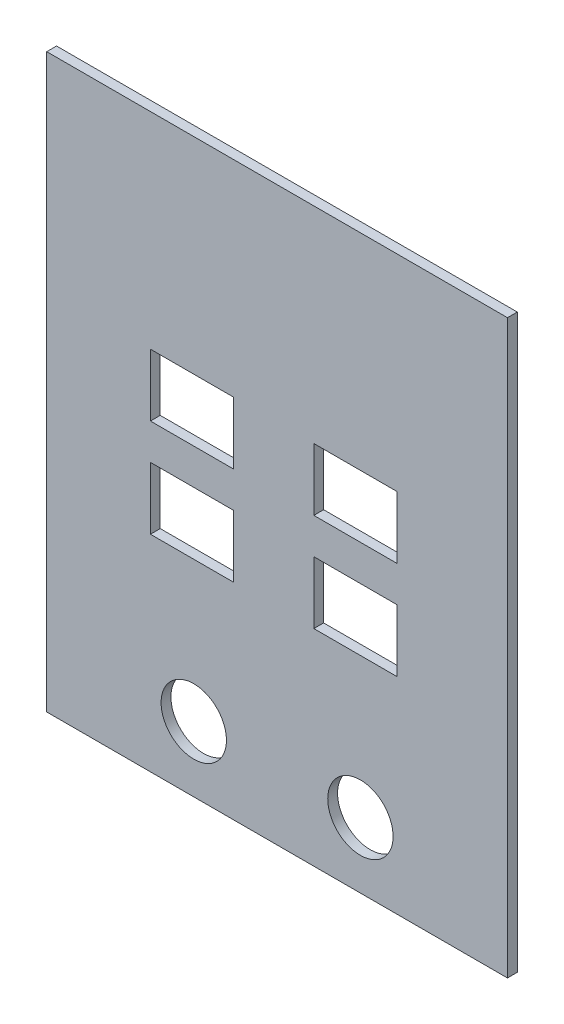
ISO-10303-21;
HEADER;
FILE_DESCRIPTION(('STEP AP214'),'2;1');
FILE_NAME('part.step','',(''),(''),'','','');
FILE_SCHEMA(('AUTOMOTIVE_DESIGN { 1 0 10303 214 1 1 1 1 }'));
ENDSEC;
DATA;
#1=APPLICATION_CONTEXT('core data for automotive mechanical design processes');
#2=APPLICATION_PROTOCOL_DEFINITION('international standard','automotive_design',2000,#1);
#3=PRODUCT_CONTEXT('',#1,'mechanical');
#4=PRODUCT('Part','Part','',(#3));
#5=PRODUCT_RELATED_PRODUCT_CATEGORY('part','',(#4));
#6=PRODUCT_DEFINITION_FORMATION('','',#4);
#7=PRODUCT_DEFINITION_CONTEXT('part definition',#1,'design');
#8=PRODUCT_DEFINITION('design','',#6,#7);
#9=PRODUCT_DEFINITION_SHAPE('','',#8);
#10=(LENGTH_UNIT() NAMED_UNIT(*) SI_UNIT(.MILLI.,.METRE.));
#11=(NAMED_UNIT(*) PLANE_ANGLE_UNIT() SI_UNIT($,.RADIAN.));
#12=(NAMED_UNIT(*) SI_UNIT($,.STERADIAN.) SOLID_ANGLE_UNIT());
#13=UNCERTAINTY_MEASURE_WITH_UNIT(LENGTH_MEASURE(1.E-05),#10,'distance_accuracy_value','');
#14=(GEOMETRIC_REPRESENTATION_CONTEXT(3) GLOBAL_UNCERTAINTY_ASSIGNED_CONTEXT((#13)) GLOBAL_UNIT_ASSIGNED_CONTEXT((#10,
#11,#12)) REPRESENTATION_CONTEXT('',''));
#15=CARTESIAN_POINT('',(0.,0.,0.));
#16=DIRECTION('',(0.,0.,1.));
#17=DIRECTION('',(1.,0.,0.));
#18=AXIS2_PLACEMENT_3D('',#15,#16,#17);
#19=CARTESIAN_POINT('',(-69.1698113207547,64.5141509433962,3.));
#20=DIRECTION('',(0.,1.,0.));
#21=DIRECTION('',(0.,0.,1.));
#22=AXIS2_PLACEMENT_3D('',#19,#20,#21);
#23=PLANE('',#22);
#24=DIRECTION('',(1.,0.,0.));
#25=VECTOR('',#24,1.);
#26=CARTESIAN_POINT('',(-69.1698113207547,64.5141509433962,0.));
#27=LINE('',#26,#25);
#28=CARTESIAN_POINT('',(-69.1698113207547,64.5141509433962,0.));
#29=VERTEX_POINT('',#28);
#30=CARTESIAN_POINT('',(71.8301886792453,64.5141509433962,0.));
#31=VERTEX_POINT('',#30);
#32=EDGE_CURVE('E325',#29,#31,#27,.T.);
#33=ORIENTED_EDGE('',*,*,#32,.F.);
#34=DIRECTION('',(0.,0.,-1.));
#35=VECTOR('',#34,1.);
#36=CARTESIAN_POINT('',(-69.1698113207547,64.5141509433962,3.));
#37=LINE('',#36,#35);
#38=CARTESIAN_POINT('',(-69.1698113207547,64.5141509433962,3.));
#39=VERTEX_POINT('',#38);
#40=EDGE_CURVE('E11',#39,#29,#37,.T.);
#41=ORIENTED_EDGE('',*,*,#40,.F.);
#42=DIRECTION('',(1.,0.,0.));
#43=VECTOR('',#42,1.);
#44=CARTESIAN_POINT('',(-69.1698113207547,64.5141509433962,3.));
#45=LINE('',#44,#43);
#46=CARTESIAN_POINT('',(71.8301886792453,64.5141509433962,3.));
#47=VERTEX_POINT('',#46);
#48=EDGE_CURVE('E326',#39,#47,#45,.T.);
#49=ORIENTED_EDGE('',*,*,#48,.T.);
#50=DIRECTION('',(0.,0.,-1.));
#51=VECTOR('',#50,1.);
#52=CARTESIAN_POINT('',(71.8301886792453,64.5141509433962,3.));
#53=LINE('',#52,#51);
#54=EDGE_CURVE('E42',#47,#31,#53,.T.);
#55=ORIENTED_EDGE('',*,*,#54,.T.);
#56=EDGE_LOOP('',(#33,#41,#49,#55));
#57=FACE_BOUND('',#56,.T.);
#58=ADVANCED_FACE('F39',(#57),#23,.T.);
#59=CARTESIAN_POINT('',(-69.1698113207547,64.5141509433962,3.));
#60=DIRECTION('',(1.,0.,0.));
#61=DIRECTION('',(0.,1.,0.));
#62=AXIS2_PLACEMENT_3D('',#59,#60,#61);
#63=PLANE('',#62);
#64=DIRECTION('',(0.,-1.,0.));
#65=VECTOR('',#64,1.);
#66=CARTESIAN_POINT('',(-69.1698113207547,64.5141509433962,0.));
#67=LINE('',#66,#65);
#68=CARTESIAN_POINT('',(-69.1698113207547,-110.485849056604,0.));
#69=VERTEX_POINT('',#68);
#70=EDGE_CURVE('E330',#29,#69,#67,.T.);
#71=ORIENTED_EDGE('',*,*,#70,.T.);
#72=DIRECTION('',(0.,0.,-1.));
#73=VECTOR('',#72,1.);
#74=CARTESIAN_POINT('',(-69.1698113207547,-110.485849056604,3.));
#75=LINE('',#74,#73);
#76=CARTESIAN_POINT('',(-69.1698113207547,-110.485849056604,3.));
#77=VERTEX_POINT('',#76);
#78=EDGE_CURVE('E47',#77,#69,#75,.T.);
#79=ORIENTED_EDGE('',*,*,#78,.F.);
#80=DIRECTION('',(0.,-1.,0.));
#81=VECTOR('',#80,1.);
#82=CARTESIAN_POINT('',(-69.1698113207547,64.5141509433962,3.));
#83=LINE('',#82,#81);
#84=EDGE_CURVE('E335',#39,#77,#83,.T.);
#85=ORIENTED_EDGE('',*,*,#84,.F.);
#86=ORIENTED_EDGE('',*,*,#40,.T.);
#87=EDGE_LOOP('',(#71,#79,#85,#86));
#88=FACE_BOUND('',#87,.T.);
#89=ADVANCED_FACE('F361',(#88),#63,.F.);
#90=CARTESIAN_POINT('',(-69.1698113207547,-110.485849056604,3.));
#91=DIRECTION('',(0.,1.,0.));
#92=DIRECTION('',(0.,0.,1.));
#93=AXIS2_PLACEMENT_3D('',#90,#91,#92);
#94=PLANE('',#93);
#95=DIRECTION('',(1.,0.,0.));
#96=VECTOR('',#95,1.);
#97=CARTESIAN_POINT('',(-69.1698113207547,-110.485849056604,0.));
#98=LINE('',#97,#96);
#99=CARTESIAN_POINT('',(71.8301886792453,-110.485849056604,0.));
#100=VERTEX_POINT('',#99);
#101=EDGE_CURVE('E342',#69,#100,#98,.T.);
#102=ORIENTED_EDGE('',*,*,#101,.T.);
#103=DIRECTION('',(0.,0.,-1.));
#104=VECTOR('',#103,1.);
#105=CARTESIAN_POINT('',(71.8301886792453,-110.485849056604,3.));
#106=LINE('',#105,#104);
#107=CARTESIAN_POINT('',(71.8301886792453,-110.485849056604,3.));
#108=VERTEX_POINT('',#107);
#109=EDGE_CURVE('E347',#108,#100,#106,.T.);
#110=ORIENTED_EDGE('',*,*,#109,.F.);
#111=DIRECTION('',(1.,0.,0.));
#112=VECTOR('',#111,1.);
#113=CARTESIAN_POINT('',(-69.1698113207547,-110.485849056604,3.));
#114=LINE('',#113,#112);
#115=EDGE_CURVE('E333',#77,#108,#114,.T.);
#116=ORIENTED_EDGE('',*,*,#115,.F.);
#117=ORIENTED_EDGE('',*,*,#78,.T.);
#118=EDGE_LOOP('',(#102,#110,#116,#117));
#119=FACE_BOUND('',#118,.T.);
#120=ADVANCED_FACE('F365',(#119),#94,.F.);
#121=CARTESIAN_POINT('',(71.8301886792453,64.5141509433962,3.));
#122=DIRECTION('',(1.,0.,0.));
#123=DIRECTION('',(0.,1.,0.));
#124=AXIS2_PLACEMENT_3D('',#121,#122,#123);
#125=PLANE('',#124);
#126=DIRECTION('',(0.,-1.,0.));
#127=VECTOR('',#126,1.);
#128=CARTESIAN_POINT('',(71.8301886792453,64.5141509433962,0.));
#129=LINE('',#128,#127);
#130=EDGE_CURVE('E339',#31,#100,#129,.T.);
#131=ORIENTED_EDGE('',*,*,#130,.F.);
#132=ORIENTED_EDGE('',*,*,#54,.F.);
#133=DIRECTION('',(0.,-1.,0.));
#134=VECTOR('',#133,1.);
#135=CARTESIAN_POINT('',(71.8301886792453,64.5141509433962,3.));
#136=LINE('',#135,#134);
#137=EDGE_CURVE('E329',#47,#108,#136,.T.);
#138=ORIENTED_EDGE('',*,*,#137,.T.);
#139=ORIENTED_EDGE('',*,*,#109,.T.);
#140=EDGE_LOOP('',(#131,#132,#138,#139));
#141=FACE_BOUND('',#140,.T.);
#142=ADVANCED_FACE('F355',(#141),#125,.T.);
#143=CARTESIAN_POINT('',(0.,0.,3.));
#144=DIRECTION('',(0.,0.,-1.));
#145=DIRECTION('',(-1.,0.,0.));
#146=AXIS2_PLACEMENT_3D('',#143,#144,#145);
#147=PLANE('',#146);
#148=CARTESIAN_POINT('',(26.8301886792453,-90.4858490566037,3.));
#149=DIRECTION('',(0.,0.,1.));
#150=DIRECTION('',(-1.,0.,0.));
#151=AXIS2_PLACEMENT_3D('',#148,#149,#150);
#152=CIRCLE('',#151,10.);
#153=CARTESIAN_POINT('',(16.8301886792453,-90.4858490566037,3.));
#154=VERTEX_POINT('',#153);
#155=EDGE_CURVE('E589',#154,#154,#152,.T.);
#156=ORIENTED_EDGE('',*,*,#155,.F.);
#157=EDGE_LOOP('',(#156));
#158=FACE_BOUND('',#157,.T.);
#159=CARTESIAN_POINT('',(-24.1698113207547,-90.4858490566037,3.));
#160=DIRECTION('',(0.,0.,1.));
#161=DIRECTION('',(1.,0.,0.));
#162=AXIS2_PLACEMENT_3D('',#159,#160,#161);
#163=CIRCLE('',#162,10.);
#164=CARTESIAN_POINT('',(-14.1698113207547,-90.4858490566037,3.));
#165=VERTEX_POINT('',#164);
#166=EDGE_CURVE('E204',#165,#165,#163,.T.);
#167=ORIENTED_EDGE('',*,*,#166,.F.);
#168=EDGE_LOOP('',(#167));
#169=FACE_BOUND('',#168,.T.);
#170=DIRECTION('',(-1.,0.,0.));
#171=VECTOR('',#170,1.);
#172=CARTESIAN_POINT('',(0.,-17.5108490566038,3.));
#173=LINE('',#172,#171);
#174=CARTESIAN_POINT('',(37.9708132382398,-17.5108490566038,3.));
#175=VERTEX_POINT('',#174);
#176=CARTESIAN_POINT('',(12.5708132382398,-17.5108490566038,3.));
#177=VERTEX_POINT('',#176);
#178=EDGE_CURVE('E281',#175,#177,#173,.T.);
#179=ORIENTED_EDGE('',*,*,#178,.T.);
#180=DIRECTION('',(0.,1.,0.));
#181=VECTOR('',#180,1.);
#182=CARTESIAN_POINT('',(12.5708132382398,0.,3.));
#183=LINE('',#182,#181);
#184=CARTESIAN_POINT('',(12.5708132382398,1.53915094339623,3.));
#185=VERTEX_POINT('',#184);
#186=EDGE_CURVE('E181',#177,#185,#183,.T.);
#187=ORIENTED_EDGE('',*,*,#186,.T.);
#188=DIRECTION('',(1.,0.,0.));
#189=VECTOR('',#188,1.);
#190=CARTESIAN_POINT('',(0.,1.53915094339623,3.));
#191=LINE('',#190,#189);
#192=CARTESIAN_POINT('',(37.9708132382398,1.53915094339623,3.));
#193=VERTEX_POINT('',#192);
#194=EDGE_CURVE('E286',#185,#193,#191,.T.);
#195=ORIENTED_EDGE('',*,*,#194,.T.);
#196=DIRECTION('',(0.,-1.,0.));
#197=VECTOR('',#196,1.);
#198=CARTESIAN_POINT('',(37.9708132382398,0.,3.));
#199=LINE('',#198,#197);
#200=EDGE_CURVE('E283',#193,#175,#199,.T.);
#201=ORIENTED_EDGE('',*,*,#200,.T.);
#202=EDGE_LOOP('',(#179,#187,#195,#201));
#203=FACE_BOUND('',#202,.T.);
#204=DIRECTION('',(-1.,0.,0.));
#205=VECTOR('',#204,1.);
#206=CARTESIAN_POINT('',(0.,-47.5108490566038,3.));
#207=LINE('',#206,#205);
#208=CARTESIAN_POINT('',(-12.0291867617601,-47.5108490566038,3.));
#209=VERTEX_POINT('',#208);
#210=CARTESIAN_POINT('',(-37.4291867617601,-47.5108490566038,3.));
#211=VERTEX_POINT('',#210);
#212=EDGE_CURVE('E269',#209,#211,#207,.T.);
#213=ORIENTED_EDGE('',*,*,#212,.T.);
#214=DIRECTION('',(0.,1.,0.));
#215=VECTOR('',#214,1.);
#216=CARTESIAN_POINT('',(-37.4291867617601,0.,3.));
#217=LINE('',#216,#215);
#218=CARTESIAN_POINT('',(-37.4291867617601,-28.4608490566038,3.));
#219=VERTEX_POINT('',#218);
#220=EDGE_CURVE('E278',#211,#219,#217,.T.);
#221=ORIENTED_EDGE('',*,*,#220,.T.);
#222=DIRECTION('',(1.,0.,0.));
#223=VECTOR('',#222,1.);
#224=CARTESIAN_POINT('',(0.,-28.4608490566038,3.));
#225=LINE('',#224,#223);
#226=CARTESIAN_POINT('',(-12.0291867617601,-28.4608490566038,3.));
#227=VERTEX_POINT('',#226);
#228=EDGE_CURVE('E275',#219,#227,#225,.T.);
#229=ORIENTED_EDGE('',*,*,#228,.T.);
#230=DIRECTION('',(0.,-1.,0.));
#231=VECTOR('',#230,1.);
#232=CARTESIAN_POINT('',(-12.0291867617601,0.,3.));
#233=LINE('',#232,#231);
#234=EDGE_CURVE('E272',#227,#209,#233,.T.);
#235=ORIENTED_EDGE('',*,*,#234,.T.);
#236=EDGE_LOOP('',(#213,#221,#229,#235));
#237=FACE_BOUND('',#236,.T.);
#238=DIRECTION('',(-1.,0.,0.));
#239=VECTOR('',#238,1.);
#240=CARTESIAN_POINT('',(0.,-17.5108490566038,3.));
#241=LINE('',#240,#239);
#242=CARTESIAN_POINT('',(-12.0291867617602,-17.5108490566038,3.));
#243=VERTEX_POINT('',#242);
#244=CARTESIAN_POINT('',(-37.4291867617602,-17.5108490566038,3.));
#245=VERTEX_POINT('',#244);
#246=EDGE_CURVE('E211',#243,#245,#241,.T.);
#247=ORIENTED_EDGE('',*,*,#246,.T.);
#248=DIRECTION('',(0.,1.,0.));
#249=VECTOR('',#248,1.);
#250=CARTESIAN_POINT('',(-37.4291867617602,0.,3.));
#251=LINE('',#250,#249);
#252=CARTESIAN_POINT('',(-37.4291867617602,1.53915094339623,3.));
#253=VERTEX_POINT('',#252);
#254=EDGE_CURVE('E266',#245,#253,#251,.T.);
#255=ORIENTED_EDGE('',*,*,#254,.T.);
#256=DIRECTION('',(1.,0.,0.));
#257=VECTOR('',#256,1.);
#258=CARTESIAN_POINT('',(0.,1.53915094339623,3.));
#259=LINE('',#258,#257);
#260=CARTESIAN_POINT('',(-12.0291867617602,1.53915094339623,3.));
#261=VERTEX_POINT('',#260);
#262=EDGE_CURVE('E263',#253,#261,#259,.T.);
#263=ORIENTED_EDGE('',*,*,#262,.T.);
#264=DIRECTION('',(0.,-1.,0.));
#265=VECTOR('',#264,1.);
#266=CARTESIAN_POINT('',(-12.0291867617602,0.,3.));
#267=LINE('',#266,#265);
#268=EDGE_CURVE('E260',#261,#243,#267,.T.);
#269=ORIENTED_EDGE('',*,*,#268,.T.);
#270=EDGE_LOOP('',(#247,#255,#263,#269));
#271=FACE_BOUND('',#270,.T.);
#272=DIRECTION('',(-1.,0.,0.));
#273=VECTOR('',#272,1.);
#274=CARTESIAN_POINT('',(0.,-47.5108490566038,3.));
#275=LINE('',#274,#273);
#276=CARTESIAN_POINT('',(37.9708132382399,-47.5108490566038,3.));
#277=VERTEX_POINT('',#276);
#278=CARTESIAN_POINT('',(12.5708132382399,-47.5108490566038,3.));
#279=VERTEX_POINT('',#278);
#280=EDGE_CURVE('E306',#277,#279,#275,.T.);
#281=ORIENTED_EDGE('',*,*,#280,.T.);
#282=DIRECTION('',(0.,1.,0.));
#283=VECTOR('',#282,1.);
#284=CARTESIAN_POINT('',(12.5708132382399,0.,3.));
#285=LINE('',#284,#283);
#286=CARTESIAN_POINT('',(12.5708132382399,-28.4608490566038,3.));
#287=VERTEX_POINT('',#286);
#288=EDGE_CURVE('E322',#279,#287,#285,.T.);
#289=ORIENTED_EDGE('',*,*,#288,.T.);
#290=DIRECTION('',(1.,0.,0.));
#291=VECTOR('',#290,1.);
#292=CARTESIAN_POINT('',(0.,-28.4608490566038,3.));
#293=LINE('',#292,#291);
#294=CARTESIAN_POINT('',(37.9708132382399,-28.4608490566038,3.));
#295=VERTEX_POINT('',#294);
#296=EDGE_CURVE('E319',#287,#295,#293,.T.);
#297=ORIENTED_EDGE('',*,*,#296,.T.);
#298=DIRECTION('',(0.,-1.,0.));
#299=VECTOR('',#298,1.);
#300=CARTESIAN_POINT('',(37.9708132382399,0.,3.));
#301=LINE('',#300,#299);
#302=EDGE_CURVE('E316',#295,#277,#301,.T.);
#303=ORIENTED_EDGE('',*,*,#302,.T.);
#304=EDGE_LOOP('',(#281,#289,#297,#303));
#305=FACE_BOUND('',#304,.T.);
#306=ORIENTED_EDGE('',*,*,#48,.F.);
#307=ORIENTED_EDGE('',*,*,#84,.T.);
#308=ORIENTED_EDGE('',*,*,#115,.T.);
#309=ORIENTED_EDGE('',*,*,#137,.F.);
#310=EDGE_LOOP('',(#306,#307,#308,#309));
#311=FACE_BOUND('',#310,.T.);
#312=ADVANCED_FACE('F367',(#158,#169,#203,#237,#271,#305,#311),#147,.F.);
#313=CARTESIAN_POINT('',(0.,0.,0.));
#314=DIRECTION('',(0.,0.,-1.));
#315=DIRECTION('',(-1.,0.,0.));
#316=AXIS2_PLACEMENT_3D('',#313,#314,#315);
#317=PLANE('',#316);
#318=CARTESIAN_POINT('',(26.8301886792453,-90.4858490566037,0.));
#319=DIRECTION('',(0.,0.,1.));
#320=DIRECTION('',(-1.,0.,0.));
#321=AXIS2_PLACEMENT_3D('',#318,#319,#320);
#322=CIRCLE('',#321,10.);
#323=CARTESIAN_POINT('',(16.8301886792453,-90.4858490566037,0.));
#324=VERTEX_POINT('',#323);
#325=EDGE_CURVE('E587',#324,#324,#322,.T.);
#326=ORIENTED_EDGE('',*,*,#325,.T.);
#327=EDGE_LOOP('',(#326));
#328=FACE_BOUND('',#327,.T.);
#329=CARTESIAN_POINT('',(-24.1698113207547,-90.4858490566037,0.));
#330=DIRECTION('',(0.,0.,1.));
#331=DIRECTION('',(1.,0.,0.));
#332=AXIS2_PLACEMENT_3D('',#329,#330,#331);
#333=CIRCLE('',#332,10.);
#334=CARTESIAN_POINT('',(-14.1698113207547,-90.4858490566037,0.));
#335=VERTEX_POINT('',#334);
#336=EDGE_CURVE('E239',#335,#335,#333,.T.);
#337=ORIENTED_EDGE('',*,*,#336,.T.);
#338=EDGE_LOOP('',(#337));
#339=FACE_BOUND('',#338,.T.);
#340=DIRECTION('',(0.,-1.,0.));
#341=VECTOR('',#340,1.);
#342=CARTESIAN_POINT('',(12.5708132382398,1.53915094339623,0.));
#343=LINE('',#342,#341);
#344=CARTESIAN_POINT('',(12.5708132382398,1.53915094339623,0.));
#345=VERTEX_POINT('',#344);
#346=CARTESIAN_POINT('',(12.5708132382398,-17.5108490566038,0.));
#347=VERTEX_POINT('',#346);
#348=EDGE_CURVE('E178',#345,#347,#343,.T.);
#349=ORIENTED_EDGE('',*,*,#348,.T.);
#350=DIRECTION('',(1.,0.,0.));
#351=VECTOR('',#350,1.);
#352=CARTESIAN_POINT('',(12.5708132382398,-17.5108490566038,0.));
#353=LINE('',#352,#351);
#354=CARTESIAN_POINT('',(37.9708132382398,-17.5108490566038,0.));
#355=VERTEX_POINT('',#354);
#356=EDGE_CURVE('E188',#347,#355,#353,.T.);
#357=ORIENTED_EDGE('',*,*,#356,.T.);
#358=DIRECTION('',(0.,1.,0.));
#359=VECTOR('',#358,1.);
#360=CARTESIAN_POINT('',(37.9708132382398,1.53915094339623,0.));
#361=LINE('',#360,#359);
#362=CARTESIAN_POINT('',(37.9708132382398,1.53915094339623,0.));
#363=VERTEX_POINT('',#362);
#364=EDGE_CURVE('E193',#355,#363,#361,.T.);
#365=ORIENTED_EDGE('',*,*,#364,.T.);
#366=DIRECTION('',(-1.,0.,0.));
#367=VECTOR('',#366,1.);
#368=CARTESIAN_POINT('',(12.5708132382398,1.53915094339623,0.));
#369=LINE('',#368,#367);
#370=EDGE_CURVE('E184',#363,#345,#369,.T.);
#371=ORIENTED_EDGE('',*,*,#370,.T.);
#372=EDGE_LOOP('',(#349,#357,#365,#371));
#373=FACE_BOUND('',#372,.T.);
#374=DIRECTION('',(0.,-1.,0.));
#375=VECTOR('',#374,1.);
#376=CARTESIAN_POINT('',(-37.4291867617601,-28.4608490566038,0.));
#377=LINE('',#376,#375);
#378=CARTESIAN_POINT('',(-37.4291867617601,-28.4608490566038,0.));
#379=VERTEX_POINT('',#378);
#380=CARTESIAN_POINT('',(-37.4291867617601,-47.5108490566038,0.));
#381=VERTEX_POINT('',#380);
#382=EDGE_CURVE('E216',#379,#381,#377,.T.);
#383=ORIENTED_EDGE('',*,*,#382,.T.);
#384=DIRECTION('',(1.,0.,0.));
#385=VECTOR('',#384,1.);
#386=CARTESIAN_POINT('',(-37.4291867617601,-47.5108490566038,0.));
#387=LINE('',#386,#385);
#388=CARTESIAN_POINT('',(-12.0291867617601,-47.5108490566038,0.));
#389=VERTEX_POINT('',#388);
#390=EDGE_CURVE('E219',#381,#389,#387,.T.);
#391=ORIENTED_EDGE('',*,*,#390,.T.);
#392=DIRECTION('',(0.,1.,0.));
#393=VECTOR('',#392,1.);
#394=CARTESIAN_POINT('',(-12.0291867617601,-28.4608490566038,0.));
#395=LINE('',#394,#393);
#396=CARTESIAN_POINT('',(-12.0291867617601,-28.4608490566038,0.));
#397=VERTEX_POINT('',#396);
#398=EDGE_CURVE('E223',#389,#397,#395,.T.);
#399=ORIENTED_EDGE('',*,*,#398,.T.);
#400=DIRECTION('',(-1.,0.,0.));
#401=VECTOR('',#400,1.);
#402=CARTESIAN_POINT('',(-37.4291867617601,-28.4608490566038,0.));
#403=LINE('',#402,#401);
#404=EDGE_CURVE('E226',#397,#379,#403,.T.);
#405=ORIENTED_EDGE('',*,*,#404,.T.);
#406=EDGE_LOOP('',(#383,#391,#399,#405));
#407=FACE_BOUND('',#406,.T.);
#408=DIRECTION('',(0.,-1.,0.));
#409=VECTOR('',#408,1.);
#410=CARTESIAN_POINT('',(-37.4291867617602,1.53915094339623,0.));
#411=LINE('',#410,#409);
#412=CARTESIAN_POINT('',(-37.4291867617602,1.53915094339623,0.));
#413=VERTEX_POINT('',#412);
#414=CARTESIAN_POINT('',(-37.4291867617602,-17.5108490566038,0.));
#415=VERTEX_POINT('',#414);
#416=EDGE_CURVE('E235',#413,#415,#411,.T.);
#417=ORIENTED_EDGE('',*,*,#416,.T.);
#418=DIRECTION('',(1.,0.,0.));
#419=VECTOR('',#418,1.);
#420=CARTESIAN_POINT('',(-37.4291867617602,-17.5108490566038,0.));
#421=LINE('',#420,#419);
#422=CARTESIAN_POINT('',(-12.0291867617602,-17.5108490566038,0.));
#423=VERTEX_POINT('',#422);
#424=EDGE_CURVE('E238',#415,#423,#421,.T.);
#425=ORIENTED_EDGE('',*,*,#424,.T.);
#426=DIRECTION('',(0.,1.,0.));
#427=VECTOR('',#426,1.);
#428=CARTESIAN_POINT('',(-12.0291867617602,1.53915094339623,0.));
#429=LINE('',#428,#427);
#430=CARTESIAN_POINT('',(-12.0291867617602,1.53915094339623,0.));
#431=VERTEX_POINT('',#430);
#432=EDGE_CURVE('E242',#423,#431,#429,.T.);
#433=ORIENTED_EDGE('',*,*,#432,.T.);
#434=DIRECTION('',(-1.,0.,0.));
#435=VECTOR('',#434,1.);
#436=CARTESIAN_POINT('',(-37.4291867617602,1.53915094339623,0.));
#437=LINE('',#436,#435);
#438=EDGE_CURVE('E245',#431,#413,#437,.T.);
#439=ORIENTED_EDGE('',*,*,#438,.T.);
#440=EDGE_LOOP('',(#417,#425,#433,#439));
#441=FACE_BOUND('',#440,.T.);
#442=DIRECTION('',(0.,-1.,0.));
#443=VECTOR('',#442,1.);
#444=CARTESIAN_POINT('',(12.5708132382399,-28.4608490566038,0.));
#445=LINE('',#444,#443);
#446=CARTESIAN_POINT('',(12.5708132382399,-28.4608490566038,0.));
#447=VERTEX_POINT('',#446);
#448=CARTESIAN_POINT('',(12.5708132382399,-47.5108490566038,0.));
#449=VERTEX_POINT('',#448);
#450=EDGE_CURVE('E290',#447,#449,#445,.T.);
#451=ORIENTED_EDGE('',*,*,#450,.T.);
#452=DIRECTION('',(1.,0.,0.));
#453=VECTOR('',#452,1.);
#454=CARTESIAN_POINT('',(12.5708132382399,-47.5108490566038,0.));
#455=LINE('',#454,#453);
#456=CARTESIAN_POINT('',(37.9708132382399,-47.5108490566038,0.));
#457=VERTEX_POINT('',#456);
#458=EDGE_CURVE('E293',#449,#457,#455,.T.);
#459=ORIENTED_EDGE('',*,*,#458,.T.);
#460=DIRECTION('',(0.,1.,0.));
#461=VECTOR('',#460,1.);
#462=CARTESIAN_POINT('',(37.9708132382399,-28.4608490566038,0.));
#463=LINE('',#462,#461);
#464=CARTESIAN_POINT('',(37.9708132382399,-28.4608490566038,0.));
#465=VERTEX_POINT('',#464);
#466=EDGE_CURVE('E296',#457,#465,#463,.T.);
#467=ORIENTED_EDGE('',*,*,#466,.T.);
#468=DIRECTION('',(-1.,0.,0.));
#469=VECTOR('',#468,1.);
#470=CARTESIAN_POINT('',(12.5708132382399,-28.4608490566038,0.));
#471=LINE('',#470,#469);
#472=EDGE_CURVE('E299',#465,#447,#471,.T.);
#473=ORIENTED_EDGE('',*,*,#472,.T.);
#474=EDGE_LOOP('',(#451,#459,#467,#473));
#475=FACE_BOUND('',#474,.T.);
#476=ORIENTED_EDGE('',*,*,#32,.T.);
#477=ORIENTED_EDGE('',*,*,#130,.T.);
#478=ORIENTED_EDGE('',*,*,#101,.F.);
#479=ORIENTED_EDGE('',*,*,#70,.F.);
#480=EDGE_LOOP('',(#476,#477,#478,#479));
#481=FACE_BOUND('',#480,.T.);
#482=ADVANCED_FACE('F195',(#328,#339,#373,#407,#441,#475,#481),#317,.T.);
#483=CARTESIAN_POINT('',(12.5708132382399,-28.4608490566038,0.));
#484=DIRECTION('',(-1.,0.,0.));
#485=DIRECTION('',(0.,0.,1.));
#486=AXIS2_PLACEMENT_3D('',#483,#484,#485);
#487=PLANE('',#486);
#488=DIRECTION('',(0.,0.,1.));
#489=VECTOR('',#488,1.);
#490=CARTESIAN_POINT('',(12.5708132382399,-47.5108490566038,0.));
#491=LINE('',#490,#489);
#492=EDGE_CURVE('E302',#449,#279,#491,.T.);
#493=ORIENTED_EDGE('',*,*,#492,.F.);
#494=ORIENTED_EDGE('',*,*,#450,.F.);
#495=DIRECTION('',(0.,0.,1.));
#496=VECTOR('',#495,1.);
#497=CARTESIAN_POINT('',(12.5708132382399,-28.4608490566038,0.));
#498=LINE('',#497,#496);
#499=EDGE_CURVE('E303',#447,#287,#498,.T.);
#500=ORIENTED_EDGE('',*,*,#499,.T.);
#501=ORIENTED_EDGE('',*,*,#288,.F.);
#502=EDGE_LOOP('',(#493,#494,#500,#501));
#503=FACE_BOUND('',#502,.T.);
#504=ADVANCED_FACE('F375',(#503),#487,.F.);
#505=CARTESIAN_POINT('',(12.5708132382399,-28.4608490566038,0.));
#506=DIRECTION('',(0.,1.,0.));
#507=DIRECTION('',(0.,0.,1.));
#508=AXIS2_PLACEMENT_3D('',#505,#506,#507);
#509=PLANE('',#508);
#510=ORIENTED_EDGE('',*,*,#499,.F.);
#511=ORIENTED_EDGE('',*,*,#472,.F.);
#512=DIRECTION('',(0.,0.,1.));
#513=VECTOR('',#512,1.);
#514=CARTESIAN_POINT('',(37.9708132382399,-28.4608490566038,0.));
#515=LINE('',#514,#513);
#516=EDGE_CURVE('E307',#465,#295,#515,.T.);
#517=ORIENTED_EDGE('',*,*,#516,.T.);
#518=ORIENTED_EDGE('',*,*,#296,.F.);
#519=EDGE_LOOP('',(#510,#511,#517,#518));
#520=FACE_BOUND('',#519,.T.);
#521=ADVANCED_FACE('F406',(#520),#509,.F.);
#522=CARTESIAN_POINT('',(37.9708132382399,-28.4608490566038,0.));
#523=DIRECTION('',(1.,0.,0.));
#524=DIRECTION('',(0.,0.,-1.));
#525=AXIS2_PLACEMENT_3D('',#522,#523,#524);
#526=PLANE('',#525);
#527=ORIENTED_EDGE('',*,*,#516,.F.);
#528=ORIENTED_EDGE('',*,*,#466,.F.);
#529=DIRECTION('',(0.,0.,1.));
#530=VECTOR('',#529,1.);
#531=CARTESIAN_POINT('',(37.9708132382399,-47.5108490566038,0.));
#532=LINE('',#531,#530);
#533=EDGE_CURVE('E310',#457,#277,#532,.T.);
#534=ORIENTED_EDGE('',*,*,#533,.T.);
#535=ORIENTED_EDGE('',*,*,#302,.F.);
#536=EDGE_LOOP('',(#527,#528,#534,#535));
#537=FACE_BOUND('',#536,.T.);
#538=ADVANCED_FACE('F416',(#537),#526,.F.);
#539=CARTESIAN_POINT('',(12.5708132382399,-47.5108490566038,0.));
#540=DIRECTION('',(0.,-1.,0.));
#541=DIRECTION('',(0.,0.,-1.));
#542=AXIS2_PLACEMENT_3D('',#539,#540,#541);
#543=PLANE('',#542);
#544=ORIENTED_EDGE('',*,*,#533,.F.);
#545=ORIENTED_EDGE('',*,*,#458,.F.);
#546=ORIENTED_EDGE('',*,*,#492,.T.);
#547=ORIENTED_EDGE('',*,*,#280,.F.);
#548=EDGE_LOOP('',(#544,#545,#546,#547));
#549=FACE_BOUND('',#548,.T.);
#550=ADVANCED_FACE('F426',(#549),#543,.F.);
#551=CARTESIAN_POINT('',(-37.4291867617602,1.53915094339623,0.));
#552=DIRECTION('',(-1.,0.,0.));
#553=DIRECTION('',(0.,0.,1.));
#554=AXIS2_PLACEMENT_3D('',#551,#552,#553);
#555=PLANE('',#554);
#556=DIRECTION('',(0.,0.,1.));
#557=VECTOR('',#556,1.);
#558=CARTESIAN_POINT('',(-37.4291867617602,-17.5108490566038,0.));
#559=LINE('',#558,#557);
#560=EDGE_CURVE('E248',#415,#245,#559,.T.);
#561=ORIENTED_EDGE('',*,*,#560,.F.);
#562=ORIENTED_EDGE('',*,*,#416,.F.);
#563=DIRECTION('',(0.,0.,1.));
#564=VECTOR('',#563,1.);
#565=CARTESIAN_POINT('',(-37.4291867617602,1.53915094339623,0.));
#566=LINE('',#565,#564);
#567=EDGE_CURVE('E220',#413,#253,#566,.T.);
#568=ORIENTED_EDGE('',*,*,#567,.T.);
#569=ORIENTED_EDGE('',*,*,#254,.F.);
#570=EDGE_LOOP('',(#561,#562,#568,#569));
#571=FACE_BOUND('',#570,.T.);
#572=ADVANCED_FACE('F436',(#571),#555,.F.);
#573=CARTESIAN_POINT('',(-37.4291867617602,1.53915094339623,0.));
#574=DIRECTION('',(0.,1.,0.));
#575=DIRECTION('',(0.,0.,1.));
#576=AXIS2_PLACEMENT_3D('',#573,#574,#575);
#577=PLANE('',#576);
#578=ORIENTED_EDGE('',*,*,#567,.F.);
#579=ORIENTED_EDGE('',*,*,#438,.F.);
#580=DIRECTION('',(0.,0.,1.));
#581=VECTOR('',#580,1.);
#582=CARTESIAN_POINT('',(-12.0291867617602,1.53915094339623,0.));
#583=LINE('',#582,#581);
#584=EDGE_CURVE('E251',#431,#261,#583,.T.);
#585=ORIENTED_EDGE('',*,*,#584,.T.);
#586=ORIENTED_EDGE('',*,*,#262,.F.);
#587=EDGE_LOOP('',(#578,#579,#585,#586));
#588=FACE_BOUND('',#587,.T.);
#589=ADVANCED_FACE('F446',(#588),#577,.F.);
#590=CARTESIAN_POINT('',(-12.0291867617602,1.53915094339623,0.));
#591=DIRECTION('',(1.,0.,0.));
#592=DIRECTION('',(0.,0.,-1.));
#593=AXIS2_PLACEMENT_3D('',#590,#591,#592);
#594=PLANE('',#593);
#595=ORIENTED_EDGE('',*,*,#584,.F.);
#596=ORIENTED_EDGE('',*,*,#432,.F.);
#597=DIRECTION('',(0.,0.,1.));
#598=VECTOR('',#597,1.);
#599=CARTESIAN_POINT('',(-12.0291867617602,-17.5108490566038,0.));
#600=LINE('',#599,#598);
#601=EDGE_CURVE('E254',#423,#243,#600,.T.);
#602=ORIENTED_EDGE('',*,*,#601,.T.);
#603=ORIENTED_EDGE('',*,*,#268,.F.);
#604=EDGE_LOOP('',(#595,#596,#602,#603));
#605=FACE_BOUND('',#604,.T.);
#606=ADVANCED_FACE('F456',(#605),#594,.F.);
#607=CARTESIAN_POINT('',(-37.4291867617602,-17.5108490566038,0.));
#608=DIRECTION('',(0.,-1.,0.));
#609=DIRECTION('',(0.,0.,-1.));
#610=AXIS2_PLACEMENT_3D('',#607,#608,#609);
#611=PLANE('',#610);
#612=ORIENTED_EDGE('',*,*,#601,.F.);
#613=ORIENTED_EDGE('',*,*,#424,.F.);
#614=ORIENTED_EDGE('',*,*,#560,.T.);
#615=ORIENTED_EDGE('',*,*,#246,.F.);
#616=EDGE_LOOP('',(#612,#613,#614,#615));
#617=FACE_BOUND('',#616,.T.);
#618=ADVANCED_FACE('F466',(#617),#611,.F.);
#619=CARTESIAN_POINT('',(-37.4291867617601,-28.4608490566038,0.));
#620=DIRECTION('',(-1.,0.,0.));
#621=DIRECTION('',(0.,0.,1.));
#622=AXIS2_PLACEMENT_3D('',#619,#620,#621);
#623=PLANE('',#622);
#624=DIRECTION('',(0.,0.,1.));
#625=VECTOR('',#624,1.);
#626=CARTESIAN_POINT('',(-37.4291867617601,-47.5108490566038,0.));
#627=LINE('',#626,#625);
#628=EDGE_CURVE('E63',#381,#211,#627,.T.);
#629=ORIENTED_EDGE('',*,*,#628,.F.);
#630=ORIENTED_EDGE('',*,*,#382,.F.);
#631=DIRECTION('',(0.,0.,1.));
#632=VECTOR('',#631,1.);
#633=CARTESIAN_POINT('',(-37.4291867617601,-28.4608490566038,0.));
#634=LINE('',#633,#632);
#635=EDGE_CURVE('E198',#379,#219,#634,.T.);
#636=ORIENTED_EDGE('',*,*,#635,.T.);
#637=ORIENTED_EDGE('',*,*,#220,.F.);
#638=EDGE_LOOP('',(#629,#630,#636,#637));
#639=FACE_BOUND('',#638,.T.);
#640=ADVANCED_FACE('F476',(#639),#623,.F.);
#641=CARTESIAN_POINT('',(-37.4291867617601,-28.4608490566038,0.));
#642=DIRECTION('',(0.,1.,0.));
#643=DIRECTION('',(0.,0.,1.));
#644=AXIS2_PLACEMENT_3D('',#641,#642,#643);
#645=PLANE('',#644);
#646=ORIENTED_EDGE('',*,*,#635,.F.);
#647=ORIENTED_EDGE('',*,*,#404,.F.);
#648=DIRECTION('',(0.,0.,1.));
#649=VECTOR('',#648,1.);
#650=CARTESIAN_POINT('',(-12.0291867617601,-28.4608490566038,0.));
#651=LINE('',#650,#649);
#652=EDGE_CURVE('E201',#397,#227,#651,.T.);
#653=ORIENTED_EDGE('',*,*,#652,.T.);
#654=ORIENTED_EDGE('',*,*,#228,.F.);
#655=EDGE_LOOP('',(#646,#647,#653,#654));
#656=FACE_BOUND('',#655,.T.);
#657=ADVANCED_FACE('F486',(#656),#645,.F.);
#658=CARTESIAN_POINT('',(-12.0291867617601,-28.4608490566038,0.));
#659=DIRECTION('',(1.,0.,0.));
#660=DIRECTION('',(0.,0.,-1.));
#661=AXIS2_PLACEMENT_3D('',#658,#659,#660);
#662=PLANE('',#661);
#663=ORIENTED_EDGE('',*,*,#652,.F.);
#664=ORIENTED_EDGE('',*,*,#398,.F.);
#665=DIRECTION('',(0.,0.,1.));
#666=VECTOR('',#665,1.);
#667=CARTESIAN_POINT('',(-12.0291867617601,-47.5108490566038,0.));
#668=LINE('',#667,#666);
#669=EDGE_CURVE('E231',#389,#209,#668,.T.);
#670=ORIENTED_EDGE('',*,*,#669,.T.);
#671=ORIENTED_EDGE('',*,*,#234,.F.);
#672=EDGE_LOOP('',(#663,#664,#670,#671));
#673=FACE_BOUND('',#672,.T.);
#674=ADVANCED_FACE('F496',(#673),#662,.F.);
#675=CARTESIAN_POINT('',(-37.4291867617601,-47.5108490566038,0.));
#676=DIRECTION('',(0.,-1.,0.));
#677=DIRECTION('',(0.,0.,-1.));
#678=AXIS2_PLACEMENT_3D('',#675,#676,#677);
#679=PLANE('',#678);
#680=ORIENTED_EDGE('',*,*,#669,.F.);
#681=ORIENTED_EDGE('',*,*,#390,.F.);
#682=ORIENTED_EDGE('',*,*,#628,.T.);
#683=ORIENTED_EDGE('',*,*,#212,.F.);
#684=EDGE_LOOP('',(#680,#681,#682,#683));
#685=FACE_BOUND('',#684,.T.);
#686=ADVANCED_FACE('F506',(#685),#679,.F.);
#687=CARTESIAN_POINT('',(12.5708132382398,1.53915094339623,0.));
#688=DIRECTION('',(-1.,0.,0.));
#689=DIRECTION('',(0.,0.,1.));
#690=AXIS2_PLACEMENT_3D('',#687,#688,#689);
#691=PLANE('',#690);
#692=DIRECTION('',(0.,0.,1.));
#693=VECTOR('',#692,1.);
#694=CARTESIAN_POINT('',(12.5708132382398,-17.5108490566038,0.));
#695=LINE('',#694,#693);
#696=EDGE_CURVE('E55',#347,#177,#695,.T.);
#697=ORIENTED_EDGE('',*,*,#696,.F.);
#698=ORIENTED_EDGE('',*,*,#348,.F.);
#699=DIRECTION('',(0.,0.,1.));
#700=VECTOR('',#699,1.);
#701=CARTESIAN_POINT('',(12.5708132382398,1.53915094339623,0.));
#702=LINE('',#701,#700);
#703=EDGE_CURVE('E209',#345,#185,#702,.T.);
#704=ORIENTED_EDGE('',*,*,#703,.T.);
#705=ORIENTED_EDGE('',*,*,#186,.F.);
#706=EDGE_LOOP('',(#697,#698,#704,#705));
#707=FACE_BOUND('',#706,.T.);
#708=ADVANCED_FACE('F175',(#707),#691,.F.);
#709=CARTESIAN_POINT('',(12.5708132382398,1.53915094339623,0.));
#710=DIRECTION('',(0.,1.,0.));
#711=DIRECTION('',(0.,0.,1.));
#712=AXIS2_PLACEMENT_3D('',#709,#710,#711);
#713=PLANE('',#712);
#714=ORIENTED_EDGE('',*,*,#703,.F.);
#715=ORIENTED_EDGE('',*,*,#370,.F.);
#716=DIRECTION('',(0.,0.,1.));
#717=VECTOR('',#716,1.);
#718=CARTESIAN_POINT('',(37.9708132382398,1.53915094339623,0.));
#719=LINE('',#718,#717);
#720=EDGE_CURVE('E212',#363,#193,#719,.T.);
#721=ORIENTED_EDGE('',*,*,#720,.T.);
#722=ORIENTED_EDGE('',*,*,#194,.F.);
#723=EDGE_LOOP('',(#714,#715,#721,#722));
#724=FACE_BOUND('',#723,.T.);
#725=ADVANCED_FACE('F524',(#724),#713,.F.);
#726=CARTESIAN_POINT('',(37.9708132382398,1.53915094339623,0.));
#727=DIRECTION('',(1.,0.,0.));
#728=DIRECTION('',(0.,1.,0.));
#729=AXIS2_PLACEMENT_3D('',#726,#727,#728);
#730=PLANE('',#729);
#731=ORIENTED_EDGE('',*,*,#720,.F.);
#732=ORIENTED_EDGE('',*,*,#364,.F.);
#733=DIRECTION('',(0.,0.,1.));
#734=VECTOR('',#733,1.);
#735=CARTESIAN_POINT('',(37.9708132382398,-17.5108490566038,0.));
#736=LINE('',#735,#734);
#737=EDGE_CURVE('E183',#355,#175,#736,.T.);
#738=ORIENTED_EDGE('',*,*,#737,.T.);
#739=ORIENTED_EDGE('',*,*,#200,.F.);
#740=EDGE_LOOP('',(#731,#732,#738,#739));
#741=FACE_BOUND('',#740,.T.);
#742=ADVANCED_FACE('F533',(#741),#730,.F.);
#743=CARTESIAN_POINT('',(12.5708132382398,-17.5108490566038,0.));
#744=DIRECTION('',(0.,-1.,0.));
#745=DIRECTION('',(0.,0.,-1.));
#746=AXIS2_PLACEMENT_3D('',#743,#744,#745);
#747=PLANE('',#746);
#748=ORIENTED_EDGE('',*,*,#737,.F.);
#749=ORIENTED_EDGE('',*,*,#356,.F.);
#750=ORIENTED_EDGE('',*,*,#696,.T.);
#751=ORIENTED_EDGE('',*,*,#178,.F.);
#752=EDGE_LOOP('',(#748,#749,#750,#751));
#753=FACE_BOUND('',#752,.T.);
#754=ADVANCED_FACE('F189',(#753),#747,.F.);
#755=CARTESIAN_POINT('',(-24.1698113207547,-90.4858490566037,0.));
#756=DIRECTION('',(0.,0.,1.));
#757=DIRECTION('',(1.,0.,0.));
#758=AXIS2_PLACEMENT_3D('',#755,#756,#757);
#759=CYLINDRICAL_SURFACE('',#758,10.);
#760=ORIENTED_EDGE('',*,*,#336,.F.);
#761=EDGE_LOOP('',(#760));
#762=FACE_BOUND('',#761,.T.);
#763=ORIENTED_EDGE('',*,*,#166,.T.);
#764=EDGE_LOOP('',(#763));
#765=FACE_BOUND('',#764,.T.);
#766=ADVANCED_FACE('F551',(#762,#765),#759,.F.);
#767=CARTESIAN_POINT('',(26.8301886792453,-90.4858490566037,0.));
#768=DIRECTION('',(0.,0.,1.));
#769=DIRECTION('',(1.,0.,0.));
#770=AXIS2_PLACEMENT_3D('',#767,#768,#769);
#771=CYLINDRICAL_SURFACE('',#770,10.);
#772=ORIENTED_EDGE('',*,*,#325,.F.);
#773=EDGE_LOOP('',(#772));
#774=FACE_BOUND('',#773,.T.);
#775=ORIENTED_EDGE('',*,*,#155,.T.);
#776=EDGE_LOOP('',(#775));
#777=FACE_BOUND('',#776,.T.);
#778=ADVANCED_FACE('F570',(#774,#777),#771,.F.);
#779=CLOSED_SHELL('',(#58,#89,#120,#142,#312,#482,#504,#521,#538,#550,#572,#589,#606,#618,#640,
#657,#674,#686,#708,#725,#742,#754,#766,#778));
#780=MANIFOLD_SOLID_BREP('B2',#779);
#781=ADVANCED_BREP_SHAPE_REPRESENTATION('',(#18,#780),#14);
#782=SHAPE_DEFINITION_REPRESENTATION(#9,#781);
ENDSEC;
END-ISO-10303-21;
